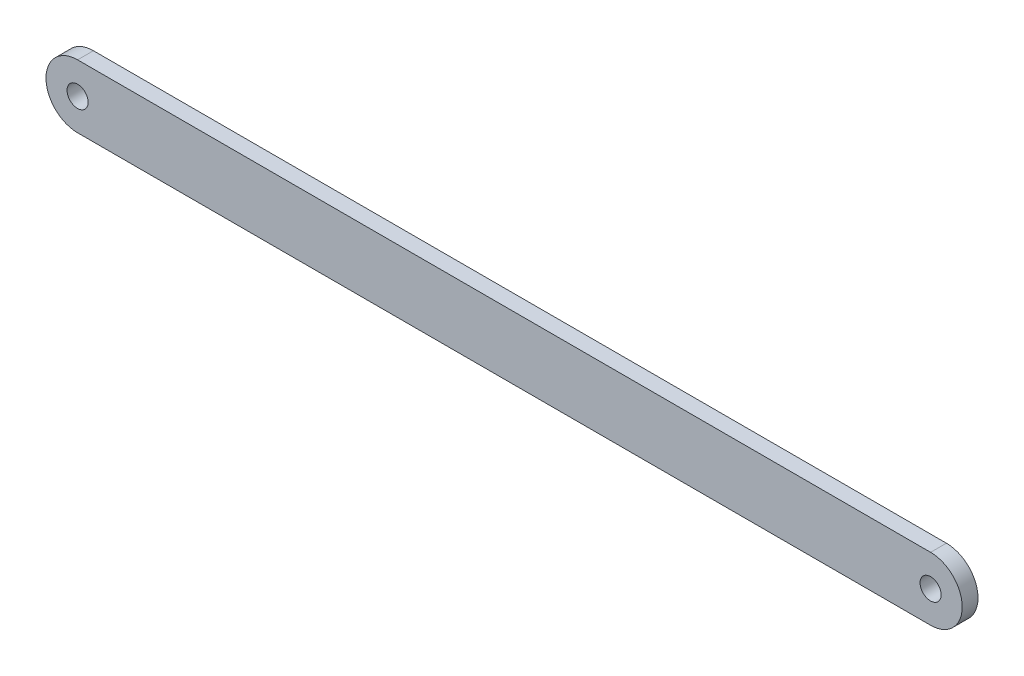
ISO-10303-21;
HEADER;
FILE_DESCRIPTION(('STEP AP214'),'2;1');
FILE_NAME('part.step','',(''),(''),'','','');
FILE_SCHEMA(('AUTOMOTIVE_DESIGN { 1 0 10303 214 1 1 1 1 }'));
ENDSEC;
DATA;
#1=APPLICATION_CONTEXT('core data for automotive mechanical design processes');
#2=APPLICATION_PROTOCOL_DEFINITION('international standard','automotive_design',2000,#1);
#3=PRODUCT_CONTEXT('',#1,'mechanical');
#4=PRODUCT('Part','Part','',(#3));
#5=PRODUCT_RELATED_PRODUCT_CATEGORY('part','',(#4));
#6=PRODUCT_DEFINITION_FORMATION('','',#4);
#7=PRODUCT_DEFINITION_CONTEXT('part definition',#1,'design');
#8=PRODUCT_DEFINITION('design','',#6,#7);
#9=PRODUCT_DEFINITION_SHAPE('','',#8);
#10=(LENGTH_UNIT() NAMED_UNIT(*) SI_UNIT(.MILLI.,.METRE.));
#11=(NAMED_UNIT(*) PLANE_ANGLE_UNIT() SI_UNIT($,.RADIAN.));
#12=(NAMED_UNIT(*) SI_UNIT($,.STERADIAN.) SOLID_ANGLE_UNIT());
#13=UNCERTAINTY_MEASURE_WITH_UNIT(LENGTH_MEASURE(1.E-05),#10,'distance_accuracy_value','');
#14=(GEOMETRIC_REPRESENTATION_CONTEXT(3) GLOBAL_UNCERTAINTY_ASSIGNED_CONTEXT((#13)) GLOBAL_UNIT_ASSIGNED_CONTEXT((#10,
#11,#12)) REPRESENTATION_CONTEXT('',''));
#15=CARTESIAN_POINT('',(0.,0.,0.));
#16=DIRECTION('',(0.,0.,1.));
#17=DIRECTION('',(1.,0.,0.));
#18=AXIS2_PLACEMENT_3D('',#15,#16,#17);
#19=CARTESIAN_POINT('',(-35.3127241673783,0.,3.));
#20=DIRECTION('',(0.,0.,1.));
#21=DIRECTION('',(1.,0.,0.));
#22=AXIS2_PLACEMENT_3D('',#19,#20,#21);
#23=PLANE('',#22);
#24=CARTESIAN_POINT('',(-35.3127241673783,0.,3.));
#25=DIRECTION('',(0.,0.,1.));
#26=DIRECTION('',(1.,0.,0.));
#27=AXIS2_PLACEMENT_3D('',#24,#25,#26);
#28=CIRCLE('',#27,2.);
#29=CARTESIAN_POINT('',(-33.3127241673783,0.,3.));
#30=VERTEX_POINT('',#29);
#31=EDGE_CURVE('E100',#30,#30,#28,.T.);
#32=ORIENTED_EDGE('',*,*,#31,.F.);
#33=EDGE_LOOP('',(#32));
#34=FACE_BOUND('',#33,.T.);
#35=CARTESIAN_POINT('',(-35.3127241673783,0.,3.));
#36=DIRECTION('',(0.,0.,1.));
#37=DIRECTION('',(1.,0.,0.));
#38=AXIS2_PLACEMENT_3D('',#35,#36,#37);
#39=CIRCLE('',#38,6.);
#40=CARTESIAN_POINT('',(-35.3127241673783,6.,3.));
#41=VERTEX_POINT('',#40);
#42=CARTESIAN_POINT('',(-35.3127241673783,-6.,3.));
#43=VERTEX_POINT('',#42);
#44=EDGE_CURVE('E85',#41,#43,#39,.T.);
#45=ORIENTED_EDGE('',*,*,#44,.T.);
#46=DIRECTION('',(1.,0.,0.));
#47=VECTOR('',#46,1.);
#48=CARTESIAN_POINT('',(-35.3127241673783,-6.,3.));
#49=LINE('',#48,#47);
#50=CARTESIAN_POINT('',(126.638875832622,-6.,3.));
#51=VERTEX_POINT('',#50);
#52=EDGE_CURVE('E80',#43,#51,#49,.T.);
#53=ORIENTED_EDGE('',*,*,#52,.T.);
#54=CARTESIAN_POINT('',(126.638875832622,0.,3.));
#55=DIRECTION('',(0.,0.,1.));
#56=DIRECTION('',(1.,0.,0.));
#57=AXIS2_PLACEMENT_3D('',#54,#55,#56);
#58=CIRCLE('',#57,6.);
#59=CARTESIAN_POINT('',(126.638875832622,6.,3.));
#60=VERTEX_POINT('',#59);
#61=EDGE_CURVE('E83',#51,#60,#58,.T.);
#62=ORIENTED_EDGE('',*,*,#61,.T.);
#63=DIRECTION('',(-1.,0.,0.));
#64=VECTOR('',#63,1.);
#65=CARTESIAN_POINT('',(-35.3127241673783,6.,3.));
#66=LINE('',#65,#64);
#67=EDGE_CURVE('E50',#60,#41,#66,.T.);
#68=ORIENTED_EDGE('',*,*,#67,.T.);
#69=EDGE_LOOP('',(#45,#53,#62,#68));
#70=FACE_BOUND('',#69,.T.);
#71=CARTESIAN_POINT('',(126.638875832622,0.,3.));
#72=DIRECTION('',(0.,0.,1.));
#73=DIRECTION('',(1.,0.,0.));
#74=AXIS2_PLACEMENT_3D('',#71,#72,#73);
#75=CIRCLE('',#74,2.);
#76=CARTESIAN_POINT('',(128.638875832622,0.,3.));
#77=VERTEX_POINT('',#76);
#78=EDGE_CURVE('E115',#77,#77,#75,.T.);
#79=ORIENTED_EDGE('',*,*,#78,.F.);
#80=EDGE_LOOP('',(#79));
#81=FACE_BOUND('',#80,.T.);
#82=ADVANCED_FACE('F33',(#34,#70,#81),#23,.T.);
#83=CARTESIAN_POINT('',(-35.3127241673783,0.,0.));
#84=DIRECTION('',(0.,0.,1.));
#85=DIRECTION('',(1.,0.,0.));
#86=AXIS2_PLACEMENT_3D('',#83,#84,#85);
#87=PLANE('',#86);
#88=CARTESIAN_POINT('',(-35.3127241673783,0.,0.));
#89=DIRECTION('',(0.,0.,1.));
#90=DIRECTION('',(1.,0.,0.));
#91=AXIS2_PLACEMENT_3D('',#88,#89,#90);
#92=CIRCLE('',#91,2.);
#93=CARTESIAN_POINT('',(-33.3127241673783,0.,0.));
#94=VERTEX_POINT('',#93);
#95=EDGE_CURVE('E112',#94,#94,#92,.T.);
#96=ORIENTED_EDGE('',*,*,#95,.T.);
#97=EDGE_LOOP('',(#96));
#98=FACE_BOUND('',#97,.T.);
#99=CARTESIAN_POINT('',(-35.3127241673783,0.,0.));
#100=DIRECTION('',(0.,0.,1.));
#101=DIRECTION('',(1.,0.,0.));
#102=AXIS2_PLACEMENT_3D('',#99,#100,#101);
#103=CIRCLE('',#102,6.);
#104=CARTESIAN_POINT('',(-35.3127241673783,6.,0.));
#105=VERTEX_POINT('',#104);
#106=CARTESIAN_POINT('',(-35.3127241673783,-6.,0.));
#107=VERTEX_POINT('',#106);
#108=EDGE_CURVE('E97',#105,#107,#103,.T.);
#109=ORIENTED_EDGE('',*,*,#108,.F.);
#110=DIRECTION('',(-1.,0.,0.));
#111=VECTOR('',#110,1.);
#112=CARTESIAN_POINT('',(-35.3127241673783,6.,0.));
#113=LINE('',#112,#111);
#114=CARTESIAN_POINT('',(126.638875832622,6.,0.));
#115=VERTEX_POINT('',#114);
#116=EDGE_CURVE('E73',#115,#105,#113,.T.);
#117=ORIENTED_EDGE('',*,*,#116,.F.);
#118=CARTESIAN_POINT('',(126.638875832622,0.,0.));
#119=DIRECTION('',(0.,0.,1.));
#120=DIRECTION('',(1.,0.,0.));
#121=AXIS2_PLACEMENT_3D('',#118,#119,#120);
#122=CIRCLE('',#121,6.);
#123=CARTESIAN_POINT('',(126.638875832622,-6.,0.));
#124=VERTEX_POINT('',#123);
#125=EDGE_CURVE('E67',#124,#115,#122,.T.);
#126=ORIENTED_EDGE('',*,*,#125,.F.);
#127=DIRECTION('',(1.,0.,0.));
#128=VECTOR('',#127,1.);
#129=CARTESIAN_POINT('',(-35.3127241673783,-6.,0.));
#130=LINE('',#129,#128);
#131=EDGE_CURVE('E89',#107,#124,#130,.T.);
#132=ORIENTED_EDGE('',*,*,#131,.F.);
#133=EDGE_LOOP('',(#109,#117,#126,#132));
#134=FACE_BOUND('',#133,.T.);
#135=CARTESIAN_POINT('',(126.638875832622,0.,0.));
#136=DIRECTION('',(0.,0.,1.));
#137=DIRECTION('',(1.,0.,0.));
#138=AXIS2_PLACEMENT_3D('',#135,#136,#137);
#139=CIRCLE('',#138,2.);
#140=CARTESIAN_POINT('',(128.638875832622,0.,0.));
#141=VERTEX_POINT('',#140);
#142=EDGE_CURVE('E118',#141,#141,#139,.T.);
#143=ORIENTED_EDGE('',*,*,#142,.T.);
#144=EDGE_LOOP('',(#143));
#145=FACE_BOUND('',#144,.T.);
#146=ADVANCED_FACE('F108',(#98,#134,#145),#87,.F.);
#147=CARTESIAN_POINT('',(-35.3127241673783,0.,3.));
#148=DIRECTION('',(0.,0.,-1.));
#149=DIRECTION('',(-1.,0.,0.));
#150=AXIS2_PLACEMENT_3D('',#147,#148,#149);
#151=CYLINDRICAL_SURFACE('',#150,6.);
#152=ORIENTED_EDGE('',*,*,#108,.T.);
#153=DIRECTION('',(0.,0.,-1.));
#154=VECTOR('',#153,1.);
#155=CARTESIAN_POINT('',(-35.3127241673783,-6.,3.));
#156=LINE('',#155,#154);
#157=EDGE_CURVE('E11',#43,#107,#156,.T.);
#158=ORIENTED_EDGE('',*,*,#157,.F.);
#159=ORIENTED_EDGE('',*,*,#44,.F.);
#160=DIRECTION('',(0.,0.,-1.));
#161=VECTOR('',#160,1.);
#162=CARTESIAN_POINT('',(-35.3127241673783,6.,3.));
#163=LINE('',#162,#161);
#164=EDGE_CURVE('E93',#41,#105,#163,.T.);
#165=ORIENTED_EDGE('',*,*,#164,.T.);
#166=EDGE_LOOP('',(#152,#158,#159,#165));
#167=FACE_BOUND('',#166,.T.);
#168=ADVANCED_FACE('F35',(#167),#151,.T.);
#169=CARTESIAN_POINT('',(-35.3127241673783,-6.,3.));
#170=DIRECTION('',(0.,1.,0.));
#171=DIRECTION('',(0.,0.,1.));
#172=AXIS2_PLACEMENT_3D('',#169,#170,#171);
#173=PLANE('',#172);
#174=ORIENTED_EDGE('',*,*,#131,.T.);
#175=DIRECTION('',(0.,0.,-1.));
#176=VECTOR('',#175,1.);
#177=CARTESIAN_POINT('',(126.638875832622,-6.,3.));
#178=LINE('',#177,#176);
#179=EDGE_CURVE('E42',#51,#124,#178,.T.);
#180=ORIENTED_EDGE('',*,*,#179,.F.);
#181=ORIENTED_EDGE('',*,*,#52,.F.);
#182=ORIENTED_EDGE('',*,*,#157,.T.);
#183=EDGE_LOOP('',(#174,#180,#181,#182));
#184=FACE_BOUND('',#183,.T.);
#185=ADVANCED_FACE('F88',(#184),#173,.F.);
#186=CARTESIAN_POINT('',(126.638875832622,0.,3.));
#187=DIRECTION('',(0.,0.,-1.));
#188=DIRECTION('',(-1.,0.,0.));
#189=AXIS2_PLACEMENT_3D('',#186,#187,#188);
#190=CYLINDRICAL_SURFACE('',#189,6.);
#191=ORIENTED_EDGE('',*,*,#125,.T.);
#192=DIRECTION('',(0.,0.,-1.));
#193=VECTOR('',#192,1.);
#194=CARTESIAN_POINT('',(126.638875832622,6.,3.));
#195=LINE('',#194,#193);
#196=EDGE_CURVE('E90',#60,#115,#195,.T.);
#197=ORIENTED_EDGE('',*,*,#196,.F.);
#198=ORIENTED_EDGE('',*,*,#61,.F.);
#199=ORIENTED_EDGE('',*,*,#179,.T.);
#200=EDGE_LOOP('',(#191,#197,#198,#199));
#201=FACE_BOUND('',#200,.T.);
#202=ADVANCED_FACE('F91',(#201),#190,.T.);
#203=CARTESIAN_POINT('',(-35.3127241673783,6.,3.));
#204=DIRECTION('',(0.,-1.,0.));
#205=DIRECTION('',(0.,0.,-1.));
#206=AXIS2_PLACEMENT_3D('',#203,#204,#205);
#207=PLANE('',#206);
#208=ORIENTED_EDGE('',*,*,#116,.T.);
#209=ORIENTED_EDGE('',*,*,#164,.F.);
#210=ORIENTED_EDGE('',*,*,#67,.F.);
#211=ORIENTED_EDGE('',*,*,#196,.T.);
#212=EDGE_LOOP('',(#208,#209,#210,#211));
#213=FACE_BOUND('',#212,.T.);
#214=ADVANCED_FACE('F105',(#213),#207,.F.);
#215=CARTESIAN_POINT('',(-35.3127241673783,0.,3.));
#216=DIRECTION('',(0.,0.,-1.));
#217=DIRECTION('',(-1.,0.,0.));
#218=AXIS2_PLACEMENT_3D('',#215,#216,#217);
#219=CYLINDRICAL_SURFACE('',#218,2.);
#220=ORIENTED_EDGE('',*,*,#31,.T.);
#221=EDGE_LOOP('',(#220));
#222=FACE_BOUND('',#221,.T.);
#223=ORIENTED_EDGE('',*,*,#95,.F.);
#224=EDGE_LOOP('',(#223));
#225=FACE_BOUND('',#224,.T.);
#226=ADVANCED_FACE('F136',(#222,#225),#219,.F.);
#227=CARTESIAN_POINT('',(126.638875832622,0.,3.));
#228=DIRECTION('',(0.,0.,-1.));
#229=DIRECTION('',(-1.,0.,0.));
#230=AXIS2_PLACEMENT_3D('',#227,#228,#229);
#231=CYLINDRICAL_SURFACE('',#230,2.);
#232=ORIENTED_EDGE('',*,*,#78,.T.);
#233=EDGE_LOOP('',(#232));
#234=FACE_BOUND('',#233,.T.);
#235=ORIENTED_EDGE('',*,*,#142,.F.);
#236=EDGE_LOOP('',(#235));
#237=FACE_BOUND('',#236,.T.);
#238=ADVANCED_FACE('F124',(#234,#237),#231,.F.);
#239=CLOSED_SHELL('',(#82,#146,#168,#185,#202,#214,#226,#238));
#240=MANIFOLD_SOLID_BREP('B2',#239);
#241=ADVANCED_BREP_SHAPE_REPRESENTATION('',(#18,#240),#14);
#242=SHAPE_DEFINITION_REPRESENTATION(#9,#241);
ENDSEC;
END-ISO-10303-21;
